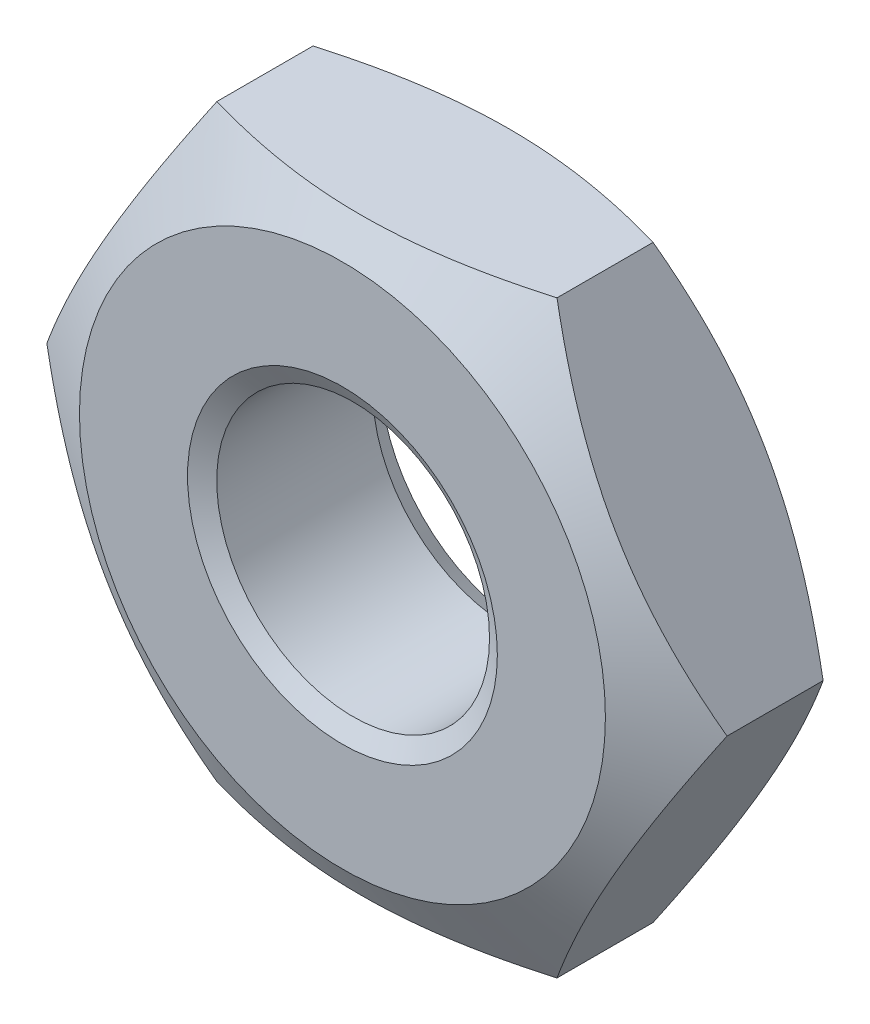
ISO-10303-21;
HEADER;
FILE_DESCRIPTION(('STEP AP214'),'2;1');
FILE_NAME('part.step','',(''),(''),'','','');
FILE_SCHEMA(('AUTOMOTIVE_DESIGN { 1 0 10303 214 1 1 1 1 }'));
ENDSEC;
DATA;
#1=APPLICATION_CONTEXT('core data for automotive mechanical design processes');
#2=APPLICATION_PROTOCOL_DEFINITION('international standard','automotive_design',2000,#1);
#3=PRODUCT_CONTEXT('',#1,'mechanical');
#4=PRODUCT('Part','Part','',(#3));
#5=PRODUCT_RELATED_PRODUCT_CATEGORY('part','',(#4));
#6=PRODUCT_DEFINITION_FORMATION('','',#4);
#7=PRODUCT_DEFINITION_CONTEXT('part definition',#1,'design');
#8=PRODUCT_DEFINITION('design','',#6,#7);
#9=PRODUCT_DEFINITION_SHAPE('','',#8);
#10=(LENGTH_UNIT() NAMED_UNIT(*) SI_UNIT(.MILLI.,.METRE.));
#11=(NAMED_UNIT(*) PLANE_ANGLE_UNIT() SI_UNIT($,.RADIAN.));
#12=(NAMED_UNIT(*) SI_UNIT($,.STERADIAN.) SOLID_ANGLE_UNIT());
#13=UNCERTAINTY_MEASURE_WITH_UNIT(LENGTH_MEASURE(1.E-05),#10,'distance_accuracy_value','');
#14=(GEOMETRIC_REPRESENTATION_CONTEXT(3) GLOBAL_UNCERTAINTY_ASSIGNED_CONTEXT((#13)) GLOBAL_UNIT_ASSIGNED_CONTEXT((#10,
#11,#12)) REPRESENTATION_CONTEXT('',''));
#15=CARTESIAN_POINT('',(0.,0.,0.));
#16=DIRECTION('',(0.,0.,1.));
#17=DIRECTION('',(1.,0.,0.));
#18=AXIS2_PLACEMENT_3D('',#15,#16,#17);
#19=CARTESIAN_POINT('',(-2.02072594216369,-3.5,-2.2));
#20=DIRECTION('',(0.,-1.,0.));
#21=DIRECTION('',(1.,0.,0.));
#22=AXIS2_PLACEMENT_3D('',#19,#20,#21);
#23=PLANE('',#22);
#24=CARTESIAN_POINT('',(-5.32929161655628,-3.5,-1.8768739570955));
#25=CARTESIAN_POINT('',(-5.17721390420334,-3.5,-1.80350487566599));
#26=CARTESIAN_POINT('',(-5.02477626879487,-3.5,-1.73086848507037));
#27=CARTESIAN_POINT('',(-4.71898932742077,-3.5,-1.58747532668502));
#28=CARTESIAN_POINT('',(-4.56563987276602,-3.5,-1.51671887634777));
#29=CARTESIAN_POINT('',(-4.25699896894404,-3.5,-1.37712246688914));
#30=CARTESIAN_POINT('',(-4.10170141818151,-3.5,-1.30829594938202));
#31=CARTESIAN_POINT('',(-3.78983593685733,-3.5,-1.17359495846471));
#32=CARTESIAN_POINT('',(-3.63326806987865,-3.5,-1.10772033836705));
#33=CARTESIAN_POINT('',(-3.31397317951131,-3.5,-0.977818284437842));
#34=CARTESIAN_POINT('',(-3.1512005381073,-3.5,-0.913902341262369));
#35=CARTESIAN_POINT('',(-2.82371486392436,-3.5,-0.791151177582951));
#36=CARTESIAN_POINT('',(-2.65900161073986,-3.5,-0.732316540636332));
#37=CARTESIAN_POINT('',(-2.32771428220931,-3.5,-0.62134515271391));
#38=CARTESIAN_POINT('',(-2.16114510129307,-3.5,-0.569193942659973));
#39=CARTESIAN_POINT('',(-1.82562056549125,-3.5,-0.473327366021486));
#40=CARTESIAN_POINT('',(-1.65666601191669,-3.5,-0.429609235647394));
#41=CARTESIAN_POINT('',(-1.31718369019254,-3.5,-0.352994778610296));
#42=CARTESIAN_POINT('',(-1.14666839877724,-3.5,-0.320044212866426));
#43=CARTESIAN_POINT('',(-0.803625193117589,-3.5,-0.266896804968947));
#44=CARTESIAN_POINT('',(-0.631097439623654,-3.5,-0.246698951170158));
#45=CARTESIAN_POINT('',(-0.287101025715154,-3.5,-0.220933629161962));
#46=CARTESIAN_POINT('',(-0.115646203356578,-3.5,-0.215185920399811));
#47=CARTESIAN_POINT('',(0.227139625224392,-3.5,-0.218339385870685));
#48=CARTESIAN_POINT('',(0.398470626774734,-3.5,-0.227241086660207));
#49=CARTESIAN_POINT('',(0.6923494546766,-3.5,-0.254460230237843));
#50=CARTESIAN_POINT('',(0.815219779631848,-3.5,-0.269472731532174));
#51=CARTESIAN_POINT('',(1.05998960024822,-3.5,-0.306041966481693));
#52=CARTESIAN_POINT('',(1.181888948341,-3.5,-0.327599676107725));
#53=CARTESIAN_POINT('',(1.54600794184171,-3.5,-0.400949728850132));
#54=CARTESIAN_POINT('',(1.78649842941779,-3.5,-0.461403324212362));
#55=CARTESIAN_POINT('',(2.14599672794727,-3.5,-0.565325828459473));
#56=CARTESIAN_POINT('',(2.26688905462246,-3.5,-0.602639268073536));
#57=CARTESIAN_POINT('',(2.50749825221244,-3.5,-0.680914127692014));
#58=CARTESIAN_POINT('',(2.62721511557209,-3.5,-0.72187557112648));
#59=CARTESIAN_POINT('',(2.86551603326948,-3.5,-0.806808159348505));
#60=CARTESIAN_POINT('',(2.98410049565285,-3.5,-0.850778169512184));
#61=CARTESIAN_POINT('',(3.22030222158571,-3.5,-0.941233650124732));
#62=CARTESIAN_POINT('',(3.33791949412912,-3.5,-0.987719097152017));
#63=CARTESIAN_POINT('',(3.60516917077565,-3.5,-1.09611499692003));
#64=CARTESIAN_POINT('',(3.75452937338733,-3.5,-1.15869521360889));
#65=CARTESIAN_POINT('',(4.05207329900666,-3.5,-1.28659848231524));
#66=CARTESIAN_POINT('',(4.20025696631961,-3.5,-1.3519216632692));
#67=CARTESIAN_POINT('',(4.64337511468222,-3.5,-1.55119395906001));
#68=CARTESIAN_POINT('',(4.93683132148516,-3.5,-1.68842699826924));
#69=CARTESIAN_POINT('',(5.52118834964412,-3.5,-1.96881056529861));
#70=CARTESIAN_POINT('',(5.81208673093574,-3.5,-2.11196612775869));
#71=CARTESIAN_POINT('',(6.39186182500917,-3.5,-2.40232740635005));
#72=CARTESIAN_POINT('',(6.6807384726872,-3.5,-2.54953325216252));
#73=CARTESIAN_POINT('',(7.23458971233424,-3.5,-2.83528891127492));
#74=CARTESIAN_POINT('',(7.49967651841012,-3.5,-2.97362193480413));
#75=CARTESIAN_POINT('',(8.02887233479629,-3.5,-3.25216194114886));
#76=CARTESIAN_POINT('',(8.29298131706612,-3.5,-3.39236897718082));
#77=CARTESIAN_POINT('',(8.81986478761872,-3.5,-3.67392059383067));
#78=CARTESIAN_POINT('',(9.082640922202,-3.5,-3.81526209803769));
#79=CARTESIAN_POINT('',(9.60756200305391,-3.5,-4.09908318288939));
#80=CARTESIAN_POINT('',(9.86970697870069,-3.5,-4.2415627091763));
#81=CARTESIAN_POINT('',(10.1316166656573,-3.5,-4.38447053028153));
#82=B_SPLINE_CURVE_WITH_KNOTS('',3,(#24,#25,#26,#27,#28,#29,#30,#31,#32,#33,#34,#35,#36,#37,#38,
#39,#40,#41,#42,#43,#44,#45,#46,#47,#48,#49,#50,#51,#52,#53,#54,#55,#56,#57,#58,#59,#60,#61,#62,
#63,#64,#65,#66,#67,#68,#69,#70,#71,#72,#73,#74,#75,#76,#77,#78,#79,#80,#81),.UNSPECIFIED.,.F.,
.F.,(4,2,2,2,2,2,2,2,2,2,2,2,2,2,2,2,2,2,2,2,2,2,2,2,2,2,2,2,4),(0.,0.506559628514695,
1.0132042594806,1.52277737705624,2.03232514447318,2.55687533860672,3.08148569427768,
3.60494121555669,4.12822489118331,4.64883048979078,5.16939478468659,5.68343298490769,
6.19748966205548,6.56865983363451,6.93988537844331,7.6827872097227,8.06231738596215,
8.44184999998748,8.82124026111235,9.20062699028891,9.68641258911835,10.1722210485271,
11.1439854050423,12.1165935361164,13.0892328442916,13.986254382644,14.8833014481238,
15.7784288466623,16.6735137420071),.UNSPECIFIED.);
#83=CARTESIAN_POINT('',(-2.02072594216369,-3.5,-0.529113742115746));
#84=VERTEX_POINT('',#83);
#85=CARTESIAN_POINT('',(2.02072594216369,-3.5,-0.529113742115746));
#86=VERTEX_POINT('',#85);
#87=EDGE_CURVE('E61',#84,#86,#82,.T.);
#88=ORIENTED_EDGE('',*,*,#87,.F.);
#89=DIRECTION('',(0.,0.,1.));
#90=VECTOR('',#89,1.);
#91=CARTESIAN_POINT('',(-2.02072594216369,-3.5,-2.2));
#92=LINE('',#91,#90);
#93=CARTESIAN_POINT('',(-2.02072594216369,-3.5,-1.67088625788425));
#94=VERTEX_POINT('',#93);
#95=EDGE_CURVE('E117',#94,#84,#92,.T.);
#96=ORIENTED_EDGE('',*,*,#95,.F.);
#97=CARTESIAN_POINT('',(-5.32929161655628,-3.5,-0.323126042904503));
#98=CARTESIAN_POINT('',(-5.17721390420334,-3.5,-0.396495124334005));
#99=CARTESIAN_POINT('',(-5.02477626879487,-3.5,-0.46913151492963));
#100=CARTESIAN_POINT('',(-4.71898932742077,-3.5,-0.612524673314982));
#101=CARTESIAN_POINT('',(-4.56563987276602,-3.5,-0.683281123652231));
#102=CARTESIAN_POINT('',(-4.25699896894404,-3.5,-0.822877533110863));
#103=CARTESIAN_POINT('',(-4.10170141818151,-3.5,-0.891704050617982));
#104=CARTESIAN_POINT('',(-3.78983593685733,-3.5,-1.02640504153529));
#105=CARTESIAN_POINT('',(-3.63326806987865,-3.5,-1.09227966163295));
#106=CARTESIAN_POINT('',(-3.31397317951131,-3.5,-1.22218171556216));
#107=CARTESIAN_POINT('',(-3.1512005381073,-3.5,-1.28609765873763));
#108=CARTESIAN_POINT('',(-2.82371486392436,-3.5,-1.40884882241705));
#109=CARTESIAN_POINT('',(-2.65900161073986,-3.5,-1.46768345936367));
#110=CARTESIAN_POINT('',(-2.32771428220931,-3.5,-1.57865484728609));
#111=CARTESIAN_POINT('',(-2.16114510129307,-3.5,-1.63080605734003));
#112=CARTESIAN_POINT('',(-1.82562056549125,-3.5,-1.72667263397851));
#113=CARTESIAN_POINT('',(-1.65666601191669,-3.5,-1.77039076435261));
#114=CARTESIAN_POINT('',(-1.31718369019254,-3.5,-1.8470052213897));
#115=CARTESIAN_POINT('',(-1.14666839877724,-3.5,-1.87995578713357));
#116=CARTESIAN_POINT('',(-0.803625193117588,-3.5,-1.93310319503105));
#117=CARTESIAN_POINT('',(-0.631097439623654,-3.5,-1.95330104882984));
#118=CARTESIAN_POINT('',(-0.287101025715154,-3.5,-1.97906637083804));
#119=CARTESIAN_POINT('',(-0.115646203356578,-3.5,-1.98481407960019));
#120=CARTESIAN_POINT('',(0.227139625224392,-3.5,-1.98166061412932));
#121=CARTESIAN_POINT('',(0.398470626774735,-3.5,-1.97275891333979));
#122=CARTESIAN_POINT('',(0.6923494546766,-3.5,-1.94553976976216));
#123=CARTESIAN_POINT('',(0.815219779631849,-3.5,-1.93052726846783));
#124=CARTESIAN_POINT('',(1.05998960024822,-3.5,-1.89395803351831));
#125=CARTESIAN_POINT('',(1.181888948341,-3.5,-1.87240032389228));
#126=CARTESIAN_POINT('',(1.54600794184172,-3.5,-1.79905027114987));
#127=CARTESIAN_POINT('',(1.78649842941779,-3.5,-1.73859667578764));
#128=CARTESIAN_POINT('',(2.14599672794727,-3.5,-1.63467417154053));
#129=CARTESIAN_POINT('',(2.26688905462246,-3.5,-1.59736073192646));
#130=CARTESIAN_POINT('',(2.50749825221244,-3.5,-1.51908587230799));
#131=CARTESIAN_POINT('',(2.62721511557209,-3.5,-1.47812442887352));
#132=CARTESIAN_POINT('',(2.86551603326948,-3.5,-1.39319184065149));
#133=CARTESIAN_POINT('',(2.98410049565285,-3.5,-1.34922183048782));
#134=CARTESIAN_POINT('',(3.22030222158572,-3.5,-1.25876634987527));
#135=CARTESIAN_POINT('',(3.33791949412912,-3.5,-1.21228090284798));
#136=CARTESIAN_POINT('',(3.60516917077565,-3.5,-1.10388500307997));
#137=CARTESIAN_POINT('',(3.75452937338733,-3.5,-1.04130478639111));
#138=CARTESIAN_POINT('',(4.05207329900666,-3.5,-0.913401517684762));
#139=CARTESIAN_POINT('',(4.20025696631961,-3.5,-0.848078336730801));
#140=CARTESIAN_POINT('',(4.64337511468222,-3.5,-0.648806040939991));
#141=CARTESIAN_POINT('',(4.93683132148517,-3.5,-0.511573001730763));
#142=CARTESIAN_POINT('',(5.52118834964412,-3.5,-0.231189434701387));
#143=CARTESIAN_POINT('',(5.81208673093574,-3.5,-0.0880338722413048));
#144=CARTESIAN_POINT('',(6.39186182500918,-3.5,0.202327406350052));
#145=CARTESIAN_POINT('',(6.6807384726872,-3.5,0.34953325216252));
#146=CARTESIAN_POINT('',(7.23458971233424,-3.5,0.635288911274919));
#147=CARTESIAN_POINT('',(7.49967651841012,-3.5,0.773621934804134));
#148=CARTESIAN_POINT('',(8.02887233479629,-3.5,1.05216194114886));
#149=CARTESIAN_POINT('',(8.29298131706612,-3.5,1.19236897718082));
#150=CARTESIAN_POINT('',(8.81986478761872,-3.5,1.47392059383067));
#151=CARTESIAN_POINT('',(9.082640922202,-3.5,1.61526209803769));
#152=CARTESIAN_POINT('',(9.60756200305391,-3.5,1.89908318288939));
#153=CARTESIAN_POINT('',(9.86970697870069,-3.5,2.0415627091763));
#154=CARTESIAN_POINT('',(10.1316166656573,-3.5,2.18447053028153));
#155=B_SPLINE_CURVE_WITH_KNOTS('',3,(#97,#98,#99,#100,#101,#102,#103,#104,#105,#106,#107,#108,
#109,#110,#111,#112,#113,#114,#115,#116,#117,#118,#119,#120,#121,#122,#123,#124,#125,#126,#127,
#128,#129,#130,#131,#132,#133,#134,#135,#136,#137,#138,#139,#140,#141,#142,#143,#144,#145,#146,
#147,#148,#149,#150,#151,#152,#153,#154),.UNSPECIFIED.,.F.,.F.,(4,2,2,2,2,2,2,2,2,2,2,2,2,2,2,2,
2,2,2,2,2,2,2,2,2,2,2,2,4),(0.,0.506559628514696,1.0132042594806,1.52277737705624,
2.03232514447318,2.55687533860672,3.08148569427768,3.60494121555669,4.12822489118331,
4.64883048979078,5.16939478468659,5.68343298490769,6.19748966205548,6.56865983363451,
6.93988537844331,7.6827872097227,8.06231738596215,8.44184999998748,8.82124026111235,
9.20062699028891,9.68641258911835,10.1722210485271,11.1439854050423,12.1165935361164,
13.0892328442916,13.986254382644,14.8833014481238,15.7784288466623,16.6735137420071),.UNSPECIFIED.);
#156=CARTESIAN_POINT('',(2.02072594216369,-3.5,-1.67088625788425));
#157=VERTEX_POINT('',#156);
#158=EDGE_CURVE('E145',#157,#94,#155,.F.);
#159=ORIENTED_EDGE('',*,*,#158,.F.);
#160=DIRECTION('',(0.,0.,1.));
#161=VECTOR('',#160,1.);
#162=CARTESIAN_POINT('',(2.02072594216369,-3.5,-2.2));
#163=LINE('',#162,#161);
#164=EDGE_CURVE('E141',#157,#86,#163,.T.);
#165=ORIENTED_EDGE('',*,*,#164,.T.);
#166=EDGE_LOOP('',(#88,#96,#159,#165));
#167=FACE_BOUND('',#166,.T.);
#168=ADVANCED_FACE('F45',(#167),#23,.T.);
#169=CARTESIAN_POINT('',(-4.04145188432738,0.,-2.2));
#170=DIRECTION('',(-0.866025403784438,-0.5,0.));
#171=DIRECTION('',(0.5,-0.866025403784439,0.));
#172=AXIS2_PLACEMENT_3D('',#169,#170,#171);
#173=PLANE('',#172);
#174=CARTESIAN_POINT('',(-4.04156735438122,0.000200000000000874,-0.529180411639474));
#175=CARTESIAN_POINT('',(-3.9527667384984,-0.153607178452449,-0.477892139936087));
#176=CARTESIAN_POINT('',(-3.86319960126198,-0.308742010834423,-0.431247304762301));
#177=CARTESIAN_POINT('',(-3.68251437287562,-0.62169800657678,-0.349828226479454));
#178=CARTESIAN_POINT('',(-3.59139307116725,-0.779524730787494,-0.315082786530667));
#179=CARTESIAN_POINT('',(-3.41027974688034,-1.09322221038013,-0.260996378128942));
#180=CARTESIAN_POINT('',(-3.32031559103708,-1.24904469916069,-0.241295437206488));
#181=CARTESIAN_POINT('',(-3.13996396008052,-1.56142288720537,-0.217776483683361));
#182=CARTESIAN_POINT('',(-3.04957714051106,-1.71797745103423,-0.213938995491671));
#183=CARTESIAN_POINT('',(-2.88068384499777,-2.01050921992099,-0.221921652823084));
#184=CARTESIAN_POINT('',(-2.80215208834114,-2.1465302124579,-0.231781785015713));
#185=CARTESIAN_POINT('',(-2.64560020969753,-2.41768602028899,-0.263032817845509));
#186=CARTESIAN_POINT('',(-2.5675806292065,-2.55281989768468,-0.284434394231903));
#187=CARTESIAN_POINT('',(-2.41070596159678,-2.82453479240518,-0.337936758826681));
#188=CARTESIAN_POINT('',(-2.33187072981463,-2.96108141927833,-0.370264345391191));
#189=CARTESIAN_POINT('',(-2.17537608630783,-3.2321380929445,-0.443635284754097));
#190=CARTESIAN_POINT('',(-2.09771466960098,-3.36665161246854,-0.48466139751597));
#191=CARTESIAN_POINT('',(-2.02061047210985,-3.5002,-0.529180411639473));
#192=B_SPLINE_CURVE_WITH_KNOTS('',3,(#174,#175,#176,#177,#178,#179,#180,#181,#182,#183,#184,
#185,#186,#187,#188,#189,#190,#191),.UNSPECIFIED.,.F.,.F.,(4,2,2,2,2,2,2,2,4),(0.,
0.554793832886253,1.11092123814983,1.65328467083218,2.19498204478403,2.6666513085086,
3.13875761298267,3.6213361260051,4.10296698719187),.UNSPECIFIED.);
#193=CARTESIAN_POINT('',(-4.04145188432738,0.,-0.529113742115746));
#194=VERTEX_POINT('',#193);
#195=EDGE_CURVE('E101',#194,#84,#192,.T.);
#196=ORIENTED_EDGE('',*,*,#195,.F.);
#197=DIRECTION('',(0.,0.,1.));
#198=VECTOR('',#197,1.);
#199=CARTESIAN_POINT('',(-4.04145188432738,0.,-2.2));
#200=LINE('',#199,#198);
#201=CARTESIAN_POINT('',(-4.04145188432738,0.,-1.67088625788425));
#202=VERTEX_POINT('',#201);
#203=EDGE_CURVE('E115',#202,#194,#200,.T.);
#204=ORIENTED_EDGE('',*,*,#203,.F.);
#205=CARTESIAN_POINT('',(-2.02061047210985,-3.5002,-1.67081958836053));
#206=CARTESIAN_POINT('',(-2.10941108799267,-3.34639282154755,-1.72210786006391));
#207=CARTESIAN_POINT('',(-2.19897822522909,-3.19125798916558,-1.7687526952377));
#208=CARTESIAN_POINT('',(-2.37966345361545,-2.87830199342322,-1.85017177352055));
#209=CARTESIAN_POINT('',(-2.47078475532382,-2.72047526921251,-1.88491721346933));
#210=CARTESIAN_POINT('',(-2.65189807961073,-2.40677778961987,-1.93900362187106));
#211=CARTESIAN_POINT('',(-2.74186223545399,-2.25095530083931,-1.95870456279351));
#212=CARTESIAN_POINT('',(-2.92221386641055,-1.93857711279463,-1.98222351631664));
#213=CARTESIAN_POINT('',(-3.01260068598001,-1.78202254896577,-1.98606100450833));
#214=CARTESIAN_POINT('',(-3.1814939814933,-1.48949078007901,-1.97807834717692));
#215=CARTESIAN_POINT('',(-3.26002573814993,-1.3534697875421,-1.96821821498429));
#216=CARTESIAN_POINT('',(-3.41657761679354,-1.08231397971101,-1.93696718215449));
#217=CARTESIAN_POINT('',(-3.49459719728457,-0.947180102315318,-1.9155656057681));
#218=CARTESIAN_POINT('',(-3.65147186489429,-0.675465207594817,-1.86206324117332));
#219=CARTESIAN_POINT('',(-3.73030709667644,-0.538918580721665,-1.82973565460881));
#220=CARTESIAN_POINT('',(-3.88680174018324,-0.267861907055498,-1.7563647152459));
#221=CARTESIAN_POINT('',(-3.96446315689009,-0.133348387531463,-1.71533860248403));
#222=CARTESIAN_POINT('',(-4.04156735438122,0.000200000000001224,-1.67081958836053));
#223=B_SPLINE_CURVE_WITH_KNOTS('',3,(#205,#206,#207,#208,#209,#210,#211,#212,#213,#214,#215,
#216,#217,#218,#219,#220,#221,#222),.UNSPECIFIED.,.F.,.F.,(4,2,2,2,2,2,2,2,4),(0.,
0.554793832886253,1.11092123814983,1.65328467083218,2.19498204478403,2.6666513085086,
3.13875761298267,3.6213361260051,4.10296698719187),.UNSPECIFIED.);
#224=EDGE_CURVE('E224',#94,#202,#223,.T.);
#225=ORIENTED_EDGE('',*,*,#224,.F.);
#226=ORIENTED_EDGE('',*,*,#95,.T.);
#227=EDGE_LOOP('',(#196,#204,#225,#226));
#228=FACE_BOUND('',#227,.T.);
#229=ADVANCED_FACE('F113',(#228),#173,.T.);
#230=CARTESIAN_POINT('',(-2.02072594216369,3.5,-2.2));
#231=DIRECTION('',(-0.866025403784439,0.5,0.));
#232=DIRECTION('',(-0.5,-0.866025403784438,0.));
#233=AXIS2_PLACEMENT_3D('',#230,#231,#232);
#234=PLANE('',#233);
#235=CARTESIAN_POINT('',(-2.02061047210985,3.5002,-0.529180411639474));
#236=CARTESIAN_POINT('',(-2.10941108799267,3.34639282154755,-0.477892139936087));
#237=CARTESIAN_POINT('',(-2.19897822522909,3.19125798916558,-0.431247304762301));
#238=CARTESIAN_POINT('',(-2.37966345361545,2.87830199342322,-0.349828226479454));
#239=CARTESIAN_POINT('',(-2.47078475532382,2.72047526921251,-0.315082786530667));
#240=CARTESIAN_POINT('',(-2.65189807961073,2.40677778961987,-0.260996378128942));
#241=CARTESIAN_POINT('',(-2.74186223545399,2.25095530083931,-0.241295437206488));
#242=CARTESIAN_POINT('',(-2.92221386641056,1.93857711279463,-0.217776483683361));
#243=CARTESIAN_POINT('',(-3.01260068598001,1.78202254896577,-0.213938995491672));
#244=CARTESIAN_POINT('',(-3.1814939814933,1.48949078007901,-0.221921652823084));
#245=CARTESIAN_POINT('',(-3.26002573814993,1.3534697875421,-0.231781785015713));
#246=CARTESIAN_POINT('',(-3.41657761679354,1.08231397971101,-0.263032817845509));
#247=CARTESIAN_POINT('',(-3.49459719728458,0.947180102315319,-0.284434394231904));
#248=CARTESIAN_POINT('',(-3.65147186489429,0.675465207594818,-0.337936758826682));
#249=CARTESIAN_POINT('',(-3.73030709667644,0.538918580721666,-0.370264345391192));
#250=CARTESIAN_POINT('',(-3.88680174018324,0.267861907055499,-0.443635284754098));
#251=CARTESIAN_POINT('',(-3.96446315689009,0.133348387531464,-0.48466139751597));
#252=CARTESIAN_POINT('',(-4.04156735438122,-0.000199999999999131,-0.529180411639474));
#253=B_SPLINE_CURVE_WITH_KNOTS('',3,(#235,#236,#237,#238,#239,#240,#241,#242,#243,#244,#245,
#246,#247,#248,#249,#250,#251,#252),.UNSPECIFIED.,.F.,.F.,(4,2,2,2,2,2,2,2,4),(0.,
0.554793832886253,1.11092123814983,1.65328467083218,2.19498204478403,2.6666513085086,
3.13875761298267,3.62133612600509,4.10296698719187),.UNSPECIFIED.);
#254=CARTESIAN_POINT('',(-2.02072594216369,3.5,-0.529113742115746));
#255=VERTEX_POINT('',#254);
#256=EDGE_CURVE('E97',#255,#194,#253,.T.);
#257=ORIENTED_EDGE('',*,*,#256,.F.);
#258=DIRECTION('',(0.,0.,1.));
#259=VECTOR('',#258,1.);
#260=CARTESIAN_POINT('',(-2.02072594216369,3.5,-2.2));
#261=LINE('',#260,#259);
#262=CARTESIAN_POINT('',(-2.02072594216369,3.5,-1.67088625788425));
#263=VERTEX_POINT('',#262);
#264=EDGE_CURVE('E124',#263,#255,#261,.T.);
#265=ORIENTED_EDGE('',*,*,#264,.F.);
#266=CARTESIAN_POINT('',(-4.04156735438122,-0.000199999999999165,-1.67081958836053));
#267=CARTESIAN_POINT('',(-3.9527667384984,0.15360717845245,-1.72210786006391));
#268=CARTESIAN_POINT('',(-3.86319960126198,0.308742010834424,-1.7687526952377));
#269=CARTESIAN_POINT('',(-3.68251437287562,0.621698006576781,-1.85017177352055));
#270=CARTESIAN_POINT('',(-3.59139307116725,0.779524730787496,-1.88491721346933));
#271=CARTESIAN_POINT('',(-3.41027974688034,1.09322221038013,-1.93900362187106));
#272=CARTESIAN_POINT('',(-3.32031559103708,1.24904469916069,-1.95870456279351));
#273=CARTESIAN_POINT('',(-3.13996396008052,1.56142288720537,-1.98222351631664));
#274=CARTESIAN_POINT('',(-3.04957714051106,1.71797745103423,-1.98606100450833));
#275=CARTESIAN_POINT('',(-2.88068384499777,2.01050921992099,-1.97807834717692));
#276=CARTESIAN_POINT('',(-2.80215208834114,2.14653021245791,-1.96821821498429));
#277=CARTESIAN_POINT('',(-2.64560020969753,2.41768602028899,-1.93696718215449));
#278=CARTESIAN_POINT('',(-2.5675806292065,2.55281989768468,-1.9155656057681));
#279=CARTESIAN_POINT('',(-2.41070596159678,2.82453479240518,-1.86206324117332));
#280=CARTESIAN_POINT('',(-2.33187072981463,2.96108141927834,-1.82973565460881));
#281=CARTESIAN_POINT('',(-2.17537608630783,3.2321380929445,-1.7563647152459));
#282=CARTESIAN_POINT('',(-2.09771466960098,3.36665161246854,-1.71533860248403));
#283=CARTESIAN_POINT('',(-2.02061047210985,3.5002,-1.67081958836053));
#284=B_SPLINE_CURVE_WITH_KNOTS('',3,(#266,#267,#268,#269,#270,#271,#272,#273,#274,#275,#276,
#277,#278,#279,#280,#281,#282,#283),.UNSPECIFIED.,.F.,.F.,(4,2,2,2,2,2,2,2,4),(0.,
0.554793832886252,1.11092123814983,1.65328467083218,2.19498204478403,2.6666513085086,
3.13875761298267,3.62133612600509,4.10296698719187),.UNSPECIFIED.);
#285=EDGE_CURVE('E122',#202,#263,#284,.T.);
#286=ORIENTED_EDGE('',*,*,#285,.F.);
#287=ORIENTED_EDGE('',*,*,#203,.T.);
#288=EDGE_LOOP('',(#257,#265,#286,#287));
#289=FACE_BOUND('',#288,.T.);
#290=ADVANCED_FACE('F121',(#289),#234,.T.);
#291=CARTESIAN_POINT('',(2.02072594216369,3.5,-2.2));
#292=DIRECTION('',(0.,1.,0.));
#293=DIRECTION('',(0.,0.,1.));
#294=AXIS2_PLACEMENT_3D('',#291,#292,#293);
#295=PLANE('',#294);
#296=CARTESIAN_POINT('',(-5.32929161654317,3.5,-1.87687395708917));
#297=CARTESIAN_POINT('',(-5.17721390419067,3.5,-1.80350487565994));
#298=CARTESIAN_POINT('',(-5.02477626878264,3.5,-1.73086848506458));
#299=CARTESIAN_POINT('',(-4.71898932740942,3.5,-1.58747532667976));
#300=CARTESIAN_POINT('',(-4.56563987275511,3.5,-1.51671887634277));
#301=CARTESIAN_POINT('',(-4.25699896893402,3.5,-1.37712246688467));
#302=CARTESIAN_POINT('',(-4.10170141817195,3.5,-1.30829594937782));
#303=CARTESIAN_POINT('',(-3.78983593684867,3.5,-1.17359495846103));
#304=CARTESIAN_POINT('',(-3.63326806987044,3.5,-1.10772033836364));
#305=CARTESIAN_POINT('',(-3.31397317950403,3.5,-0.977818284434954));
#306=CARTESIAN_POINT('',(-3.1512005381005,3.5,-0.913902341259745));
#307=CARTESIAN_POINT('',(-2.82371486391854,3.5,-0.791151177580841));
#308=CARTESIAN_POINT('',(-2.65900161073452,3.5,-0.732316540634472));
#309=CARTESIAN_POINT('',(-2.32771428220496,3.5,-0.621345152712525));
#310=CARTESIAN_POINT('',(-2.16114510128922,3.5,-0.569193942658812));
#311=CARTESIAN_POINT('',(-1.82562056548841,3.5,-0.473327366020735));
#312=CARTESIAN_POINT('',(-1.65666601191436,3.5,-0.42960923564683));
#313=CARTESIAN_POINT('',(-1.31718369019152,3.5,-0.352994778610105));
#314=CARTESIAN_POINT('',(-1.14666839877701,3.5,-0.320044212866405));
#315=CARTESIAN_POINT('',(-0.803625193118965,3.5,-0.266896804969146));
#316=CARTESIAN_POINT('',(-0.631097439625841,3.5,-0.246698951170405));
#317=CARTESIAN_POINT('',(-0.287101025718949,3.5,-0.220933629162164));
#318=CARTESIAN_POINT('',(-0.115646203361171,3.5,-0.215185920399921));
#319=CARTESIAN_POINT('',(0.227139625218219,3.5,-0.218339385870476));
#320=CARTESIAN_POINT('',(0.39847062676778,3.5,-0.227241086659772));
#321=CARTESIAN_POINT('',(0.692349454668639,3.5,-0.254460230236955));
#322=CARTESIAN_POINT('',(0.815219779623655,3.5,-0.269472731531103));
#323=CARTESIAN_POINT('',(1.05998960023958,3.5,-0.306041966480247));
#324=CARTESIAN_POINT('',(1.18188894833212,3.5,-0.327599676106087));
#325=CARTESIAN_POINT('',(1.54600794183219,3.5,-0.400949728847913));
#326=CARTESIAN_POINT('',(1.78649842940784,3.5,-0.461403324209749));
#327=CARTESIAN_POINT('',(2.14599672793669,3.5,-0.565325828456279));
#328=CARTESIAN_POINT('',(2.26688905461166,3.5,-0.602639268070147));
#329=CARTESIAN_POINT('',(2.50749825220121,3.5,-0.68091412768824));
#330=CARTESIAN_POINT('',(2.62721511556065,3.5,-0.721875571122515));
#331=CARTESIAN_POINT('',(2.86551603325762,3.5,-0.806808159344166));
#332=CARTESIAN_POINT('',(2.98410049564078,3.5,-0.850778169507661));
#333=CARTESIAN_POINT('',(3.22030222157322,3.5,-0.941233650119847));
#334=CARTESIAN_POINT('',(3.33791949411641,3.5,-0.987719097146953));
#335=CARTESIAN_POINT('',(3.60516917076279,3.5,-1.0961149969147));
#336=CARTESIAN_POINT('',(3.75452937337452,3.5,-1.15869521360348));
#337=CARTESIAN_POINT('',(4.05207329899395,3.5,-1.28659848230968));
#338=CARTESIAN_POINT('',(4.20025696630695,3.5,-1.35192166326358));
#339=CARTESIAN_POINT('',(4.64337511466969,3.5,-1.55119395905422));
#340=CARTESIAN_POINT('',(4.93683132147272,3.5,-1.68842699826337));
#341=CARTESIAN_POINT('',(5.52118834963183,3.5,-1.96881056529261));
#342=CARTESIAN_POINT('',(5.81208673092351,3.5,-2.11196612775264));
#343=CARTESIAN_POINT('',(6.39186182499708,3.5,-2.40232740634392));
#344=CARTESIAN_POINT('',(6.68073847267516,3.5,-2.54953325215636));
#345=CARTESIAN_POINT('',(7.23458971232227,3.5,-2.83528891126869));
#346=CARTESIAN_POINT('',(7.49967651839816,3.5,-2.97362193479787));
#347=CARTESIAN_POINT('',(8.02887233478434,3.5,-3.25216194114253));
#348=CARTESIAN_POINT('',(8.29298131705417,3.5,-3.39236897717446));
#349=CARTESIAN_POINT('',(8.81986478760678,3.5,-3.67392059382426));
#350=CARTESIAN_POINT('',(9.08264092219005,3.5,-3.81526209803125));
#351=CARTESIAN_POINT('',(9.60756200304195,3.5,-4.0990831828829));
#352=CARTESIAN_POINT('',(9.86970697868872,3.5,-4.24156270916979));
#353=CARTESIAN_POINT('',(10.1316166656453,3.5,-4.384470530275));
#354=B_SPLINE_CURVE_WITH_KNOTS('',3,(#296,#297,#298,#299,#300,#301,#302,#303,#304,#305,#306,
#307,#308,#309,#310,#311,#312,#313,#314,#315,#316,#317,#318,#319,#320,#321,#322,#323,#324,#325,
#326,#327,#328,#329,#330,#331,#332,#333,#334,#335,#336,#337,#338,#339,#340,#341,#342,#343,#344,
#345,#346,#347,#348,#349,#350,#351,#352,#353),.UNSPECIFIED.,.F.,.F.,(4,2,2,2,2,2,2,2,2,2,2,2,2,
2,2,2,2,2,2,2,2,2,2,2,2,2,2,2,4),(0.,0.50655962851316,1.01320425947753,1.52277737705162,
2.03232514446701,2.55687533859891,3.08148569426823,3.60494121554562,4.12822489117061,
4.64883048977565,5.16939478466903,5.68343298488776,6.19748966203318,6.56865983361145,
6.93988537841949,7.68278720969736,8.06231738593603,8.44184999996057,8.82124026108465,
9.20062699026042,9.68641258908992,10.1722210484987,11.143985405014,12.1165935360882,
13.0892328442636,13.9862543826159,14.8833014480957,15.7784288466341,16.6735137419789),.UNSPECIFIED.);
#355=CARTESIAN_POINT('',(2.02072594216369,3.5,-0.529113742115746));
#356=VERTEX_POINT('',#355);
#357=EDGE_CURVE('E103',#356,#255,#354,.F.);
#358=ORIENTED_EDGE('',*,*,#357,.F.);
#359=DIRECTION('',(0.,0.,1.));
#360=VECTOR('',#359,1.);
#361=CARTESIAN_POINT('',(2.02072594216369,3.5,-2.2));
#362=LINE('',#361,#360);
#363=CARTESIAN_POINT('',(2.02072594216369,3.5,-1.67088625788425));
#364=VERTEX_POINT('',#363);
#365=EDGE_CURVE('E130',#364,#356,#362,.T.);
#366=ORIENTED_EDGE('',*,*,#365,.F.);
#367=CARTESIAN_POINT('',(-5.32929161654317,3.5,-0.323126042910828));
#368=CARTESIAN_POINT('',(-5.17721390419067,3.5,-0.396495124340064));
#369=CARTESIAN_POINT('',(-5.02477626878264,3.5,-0.469131514935422));
#370=CARTESIAN_POINT('',(-4.71898932740942,3.5,-0.612524673320243));
#371=CARTESIAN_POINT('',(-4.56563987275511,3.5,-0.683281123657226));
#372=CARTESIAN_POINT('',(-4.25699896893402,3.5,-0.822877533115329));
#373=CARTESIAN_POINT('',(-4.10170141817195,3.5,-0.891704050622182));
#374=CARTESIAN_POINT('',(-3.78983593684867,3.5,-1.02640504153897));
#375=CARTESIAN_POINT('',(-3.63326806987044,3.5,-1.09227966163636));
#376=CARTESIAN_POINT('',(-3.31397317950403,3.5,-1.22218171556505));
#377=CARTESIAN_POINT('',(-3.1512005381005,3.5,-1.28609765874026));
#378=CARTESIAN_POINT('',(-2.82371486391854,3.5,-1.40884882241916));
#379=CARTESIAN_POINT('',(-2.65900161073452,3.5,-1.46768345936553));
#380=CARTESIAN_POINT('',(-2.32771428220496,3.5,-1.57865484728748));
#381=CARTESIAN_POINT('',(-2.16114510128922,3.5,-1.63080605734119));
#382=CARTESIAN_POINT('',(-1.82562056548841,3.5,-1.72667263397926));
#383=CARTESIAN_POINT('',(-1.65666601191436,3.5,-1.77039076435317));
#384=CARTESIAN_POINT('',(-1.31718369019152,3.5,-1.8470052213899));
#385=CARTESIAN_POINT('',(-1.14666839877701,3.5,-1.87995578713359));
#386=CARTESIAN_POINT('',(-0.803625193118965,3.5,-1.93310319503085));
#387=CARTESIAN_POINT('',(-0.631097439625842,3.5,-1.95330104882959));
#388=CARTESIAN_POINT('',(-0.287101025718949,3.5,-1.97906637083784));
#389=CARTESIAN_POINT('',(-0.115646203361171,3.5,-1.98481407960008));
#390=CARTESIAN_POINT('',(0.227139625218219,3.5,-1.98166061412952));
#391=CARTESIAN_POINT('',(0.398470626767779,3.5,-1.97275891334023));
#392=CARTESIAN_POINT('',(0.692349454668638,3.5,-1.94553976976305));
#393=CARTESIAN_POINT('',(0.815219779623654,3.5,-1.9305272684689));
#394=CARTESIAN_POINT('',(1.05998960023957,3.5,-1.89395803351975));
#395=CARTESIAN_POINT('',(1.18188894833212,3.5,-1.87240032389391));
#396=CARTESIAN_POINT('',(1.54600794183219,3.5,-1.79905027115209));
#397=CARTESIAN_POINT('',(1.78649842940784,3.5,-1.73859667579025));
#398=CARTESIAN_POINT('',(2.14599672793669,3.5,-1.63467417154372));
#399=CARTESIAN_POINT('',(2.26688905461166,3.5,-1.59736073192985));
#400=CARTESIAN_POINT('',(2.50749825220121,3.5,-1.51908587231176));
#401=CARTESIAN_POINT('',(2.62721511556065,3.5,-1.47812442887749));
#402=CARTESIAN_POINT('',(2.86551603325762,3.5,-1.39319184065583));
#403=CARTESIAN_POINT('',(2.98410049564077,3.5,-1.34922183049234));
#404=CARTESIAN_POINT('',(3.22030222157322,3.5,-1.25876634988015));
#405=CARTESIAN_POINT('',(3.33791949411641,3.5,-1.21228090285305));
#406=CARTESIAN_POINT('',(3.60516917076279,3.5,-1.1038850030853));
#407=CARTESIAN_POINT('',(3.75452937337452,3.5,-1.04130478639652));
#408=CARTESIAN_POINT('',(4.05207329899395,3.5,-0.913401517690318));
#409=CARTESIAN_POINT('',(4.20025696630695,3.5,-0.84807833673642));
#410=CARTESIAN_POINT('',(4.64337511466969,3.5,-0.648806040945776));
#411=CARTESIAN_POINT('',(4.93683132147272,3.5,-0.511573001736632));
#412=CARTESIAN_POINT('',(5.52118834963183,3.5,-0.23118943470739));
#413=CARTESIAN_POINT('',(5.81208673092351,3.5,-0.088033872247357));
#414=CARTESIAN_POINT('',(6.39186182499708,3.5,0.202327406343922));
#415=CARTESIAN_POINT('',(6.68073847267516,3.5,0.349533252156361));
#416=CARTESIAN_POINT('',(7.23458971232227,3.5,0.635288911268695));
#417=CARTESIAN_POINT('',(7.49967651839816,3.5,0.773621934797874));
#418=CARTESIAN_POINT('',(8.02887233478434,3.5,1.05216194114253));
#419=CARTESIAN_POINT('',(8.29298131705417,3.5,1.19236897717446));
#420=CARTESIAN_POINT('',(8.81986478760678,3.5,1.47392059382426));
#421=CARTESIAN_POINT('',(9.08264092219005,3.5,1.61526209803125));
#422=CARTESIAN_POINT('',(9.60756200304195,3.5,1.8990831828829));
#423=CARTESIAN_POINT('',(9.86970697868872,3.5,2.04156270916979));
#424=CARTESIAN_POINT('',(10.1316166656453,3.5,2.18447053027499));
#425=B_SPLINE_CURVE_WITH_KNOTS('',3,(#367,#368,#369,#370,#371,#372,#373,#374,#375,#376,#377,
#378,#379,#380,#381,#382,#383,#384,#385,#386,#387,#388,#389,#390,#391,#392,#393,#394,#395,#396,
#397,#398,#399,#400,#401,#402,#403,#404,#405,#406,#407,#408,#409,#410,#411,#412,#413,#414,#415,
#416,#417,#418,#419,#420,#421,#422,#423,#424),.UNSPECIFIED.,.F.,.F.,(4,2,2,2,2,2,2,2,2,2,2,2,2,
2,2,2,2,2,2,2,2,2,2,2,2,2,2,2,4),(0.,0.506559628513161,1.01320425947753,1.52277737705162,
2.03232514446701,2.55687533859891,3.08148569426823,3.60494121554562,4.12822489117061,
4.64883048977565,5.16939478466903,5.68343298488776,6.19748966203318,6.56865983361145,
6.9398853784195,7.68278720969736,8.06231738593603,8.44184999996057,8.82124026108465,
9.20062699026042,9.68641258908992,10.1722210484987,11.143985405014,12.1165935360882,
13.0892328442636,13.986254382616,14.8833014480957,15.7784288466341,16.673513741979),.UNSPECIFIED.);
#426=EDGE_CURVE('E211',#263,#364,#425,.T.);
#427=ORIENTED_EDGE('',*,*,#426,.F.);
#428=ORIENTED_EDGE('',*,*,#264,.T.);
#429=EDGE_LOOP('',(#358,#366,#427,#428));
#430=FACE_BOUND('',#429,.T.);
#431=ADVANCED_FACE('F261',(#430),#295,.T.);
#432=CARTESIAN_POINT('',(4.04145188432738,0.,-2.2));
#433=DIRECTION('',(0.866025403784438,0.5,0.));
#434=DIRECTION('',(-0.5,0.866025403784438,0.));
#435=AXIS2_PLACEMENT_3D('',#432,#433,#434);
#436=PLANE('',#435);
#437=CARTESIAN_POINT('',(4.04156735438122,-0.000199999999998962,-0.529180411639473));
#438=CARTESIAN_POINT('',(3.9527667384984,0.153607178452451,-0.477892139936087));
#439=CARTESIAN_POINT('',(3.86319960126198,0.308742010834425,-0.431247304762301));
#440=CARTESIAN_POINT('',(3.68251437287562,0.621698006576781,-0.349828226479453));
#441=CARTESIAN_POINT('',(3.59139307116725,0.779524730787496,-0.315082786530667));
#442=CARTESIAN_POINT('',(3.41027974688034,1.09322221038013,-0.260996378128942));
#443=CARTESIAN_POINT('',(3.32031559103708,1.24904469916069,-0.241295437206487));
#444=CARTESIAN_POINT('',(3.13996396008052,1.56142288720537,-0.21777648368336));
#445=CARTESIAN_POINT('',(3.04957714051106,1.71797745103423,-0.213938995491671));
#446=CARTESIAN_POINT('',(2.88068384499777,2.01050921992099,-0.221921652823083));
#447=CARTESIAN_POINT('',(2.80215208834114,2.1465302124579,-0.231781785015712));
#448=CARTESIAN_POINT('',(2.64560020969753,2.41768602028899,-0.263032817845508));
#449=CARTESIAN_POINT('',(2.5675806292065,2.55281989768468,-0.284434394231903));
#450=CARTESIAN_POINT('',(2.41070596159678,2.82453479240518,-0.337936758826681));
#451=CARTESIAN_POINT('',(2.33187072981463,2.96108141927833,-0.370264345391191));
#452=CARTESIAN_POINT('',(2.17537608630783,3.2321380929445,-0.443635284754097));
#453=CARTESIAN_POINT('',(2.09771466960098,3.36665161246854,-0.484661397515969));
#454=CARTESIAN_POINT('',(2.02061047210985,3.5002,-0.529180411639473));
#455=B_SPLINE_CURVE_WITH_KNOTS('',3,(#437,#438,#439,#440,#441,#442,#443,#444,#445,#446,#447,
#448,#449,#450,#451,#452,#453,#454),.UNSPECIFIED.,.F.,.F.,(4,2,2,2,2,2,2,2,4),(0.,
0.554793832886253,1.11092123814983,1.65328467083218,2.19498204478403,2.6666513085086,
3.13875761298267,3.62133612600509,4.10296698719187),.UNSPECIFIED.);
#456=CARTESIAN_POINT('',(4.04145188432738,0.,-0.529113742115746));
#457=VERTEX_POINT('',#456);
#458=EDGE_CURVE('E255',#457,#356,#455,.T.);
#459=ORIENTED_EDGE('',*,*,#458,.F.);
#460=DIRECTION('',(0.,0.,1.));
#461=VECTOR('',#460,1.);
#462=CARTESIAN_POINT('',(4.04145188432738,0.,-2.2));
#463=LINE('',#462,#461);
#464=CARTESIAN_POINT('',(4.04145188432738,0.,-1.67088625788425));
#465=VERTEX_POINT('',#464);
#466=EDGE_CURVE('E137',#465,#457,#463,.T.);
#467=ORIENTED_EDGE('',*,*,#466,.F.);
#468=CARTESIAN_POINT('',(2.02061047210985,3.5002,-1.67081958836053));
#469=CARTESIAN_POINT('',(2.10941108799267,3.34639282154755,-1.72210786006391));
#470=CARTESIAN_POINT('',(2.19897822522909,3.19125798916558,-1.7687526952377));
#471=CARTESIAN_POINT('',(2.37966345361545,2.87830199342322,-1.85017177352055));
#472=CARTESIAN_POINT('',(2.47078475532382,2.72047526921251,-1.88491721346933));
#473=CARTESIAN_POINT('',(2.65189807961073,2.40677778961987,-1.93900362187106));
#474=CARTESIAN_POINT('',(2.74186223545399,2.25095530083931,-1.95870456279351));
#475=CARTESIAN_POINT('',(2.92221386641055,1.93857711279463,-1.98222351631664));
#476=CARTESIAN_POINT('',(3.01260068598001,1.78202254896577,-1.98606100450833));
#477=CARTESIAN_POINT('',(3.1814939814933,1.48949078007901,-1.97807834717692));
#478=CARTESIAN_POINT('',(3.26002573814992,1.3534697875421,-1.96821821498429));
#479=CARTESIAN_POINT('',(3.41657761679353,1.08231397971101,-1.93696718215449));
#480=CARTESIAN_POINT('',(3.49459719728457,0.947180102315319,-1.9155656057681));
#481=CARTESIAN_POINT('',(3.65147186489429,0.675465207594818,-1.86206324117332));
#482=CARTESIAN_POINT('',(3.73030709667644,0.538918580721666,-1.82973565460881));
#483=CARTESIAN_POINT('',(3.88680174018324,0.2678619070555,-1.7563647152459));
#484=CARTESIAN_POINT('',(3.96446315689009,0.133348387531464,-1.71533860248403));
#485=CARTESIAN_POINT('',(4.04156735438122,-0.000199999999999034,-1.67081958836053));
#486=B_SPLINE_CURVE_WITH_KNOTS('',3,(#468,#469,#470,#471,#472,#473,#474,#475,#476,#477,#478,
#479,#480,#481,#482,#483,#484,#485),.UNSPECIFIED.,.F.,.F.,(4,2,2,2,2,2,2,2,4),(0.,
0.554793832886253,1.11092123814983,1.65328467083218,2.19498204478403,2.6666513085086,
3.13875761298267,3.62133612600509,4.10296698719187),.UNSPECIFIED.);
#487=EDGE_CURVE('E69',#364,#465,#486,.T.);
#488=ORIENTED_EDGE('',*,*,#487,.F.);
#489=ORIENTED_EDGE('',*,*,#365,.T.);
#490=EDGE_LOOP('',(#459,#467,#488,#489));
#491=FACE_BOUND('',#490,.T.);
#492=ADVANCED_FACE('F264',(#491),#436,.T.);
#493=CARTESIAN_POINT('',(2.02072594216369,-3.5,-2.2));
#494=DIRECTION('',(0.866025403784439,-0.5,0.));
#495=DIRECTION('',(0.5,0.866025403784439,0.));
#496=AXIS2_PLACEMENT_3D('',#493,#494,#495);
#497=PLANE('',#496);
#498=CARTESIAN_POINT('',(2.02061047210985,-3.5002,-0.529180411639474));
#499=CARTESIAN_POINT('',(2.10941108799267,-3.34639282154755,-0.477892139936087));
#500=CARTESIAN_POINT('',(2.19897822522909,-3.19125798916558,-0.431247304762301));
#501=CARTESIAN_POINT('',(2.37966345361545,-2.87830199342322,-0.349828226479453));
#502=CARTESIAN_POINT('',(2.47078475532382,-2.7204752692125,-0.315082786530666));
#503=CARTESIAN_POINT('',(2.65189807961073,-2.40677778961987,-0.260996378128942));
#504=CARTESIAN_POINT('',(2.74186223545399,-2.25095530083931,-0.241295437206487));
#505=CARTESIAN_POINT('',(2.92221386641055,-1.93857711279463,-0.21777648368336));
#506=CARTESIAN_POINT('',(3.01260068598001,-1.78202254896577,-0.213938995491671));
#507=CARTESIAN_POINT('',(3.1814939814933,-1.48949078007901,-0.221921652823084));
#508=CARTESIAN_POINT('',(3.26002573814993,-1.35346978754209,-0.231781785015713));
#509=CARTESIAN_POINT('',(3.41657761679353,-1.08231397971101,-0.263032817845509));
#510=CARTESIAN_POINT('',(3.49459719728457,-0.947180102315318,-0.284434394231903));
#511=CARTESIAN_POINT('',(3.65147186489429,-0.675465207594817,-0.337936758826681));
#512=CARTESIAN_POINT('',(3.73030709667644,-0.538918580721665,-0.370264345391191));
#513=CARTESIAN_POINT('',(3.88680174018324,-0.267861907055498,-0.443635284754097));
#514=CARTESIAN_POINT('',(3.96446315689009,-0.133348387531463,-0.484661397515969));
#515=CARTESIAN_POINT('',(4.04156735438122,0.000200000000001226,-0.529180411639473));
#516=B_SPLINE_CURVE_WITH_KNOTS('',3,(#498,#499,#500,#501,#502,#503,#504,#505,#506,#507,#508,
#509,#510,#511,#512,#513,#514,#515),.UNSPECIFIED.,.F.,.F.,(4,2,2,2,2,2,2,2,4),(0.,
0.554793832886253,1.11092123814984,1.65328467083218,2.19498204478403,2.6666513085086,
3.13875761298267,3.62133612600509,4.10296698719187),.UNSPECIFIED.);
#517=EDGE_CURVE('E285',#86,#457,#516,.T.);
#518=ORIENTED_EDGE('',*,*,#517,.F.);
#519=ORIENTED_EDGE('',*,*,#164,.F.);
#520=CARTESIAN_POINT('',(4.04156735438122,0.000200000000001091,-1.67081958836053));
#521=CARTESIAN_POINT('',(3.9527667384984,-0.153607178452448,-1.72210786006391));
#522=CARTESIAN_POINT('',(3.86319960126198,-0.308742010834423,-1.7687526952377));
#523=CARTESIAN_POINT('',(3.68251437287562,-0.62169800657678,-1.85017177352055));
#524=CARTESIAN_POINT('',(3.59139307116725,-0.779524730787494,-1.88491721346933));
#525=CARTESIAN_POINT('',(3.41027974688034,-1.09322221038012,-1.93900362187106));
#526=CARTESIAN_POINT('',(3.32031559103708,-1.24904469916069,-1.95870456279351));
#527=CARTESIAN_POINT('',(3.13996396008052,-1.56142288720537,-1.98222351631664));
#528=CARTESIAN_POINT('',(3.04957714051106,-1.71797745103423,-1.98606100450833));
#529=CARTESIAN_POINT('',(2.88068384499777,-2.01050921992099,-1.97807834717692));
#530=CARTESIAN_POINT('',(2.80215208834114,-2.1465302124579,-1.96821821498429));
#531=CARTESIAN_POINT('',(2.64560020969753,-2.41768602028899,-1.93696718215449));
#532=CARTESIAN_POINT('',(2.5675806292065,-2.55281989768468,-1.9155656057681));
#533=CARTESIAN_POINT('',(2.41070596159678,-2.82453479240518,-1.86206324117332));
#534=CARTESIAN_POINT('',(2.33187072981463,-2.96108141927833,-1.82973565460881));
#535=CARTESIAN_POINT('',(2.17537608630783,-3.2321380929445,-1.7563647152459));
#536=CARTESIAN_POINT('',(2.09771466960098,-3.36665161246854,-1.71533860248403));
#537=CARTESIAN_POINT('',(2.02061047210985,-3.5002,-1.67081958836053));
#538=B_SPLINE_CURVE_WITH_KNOTS('',3,(#520,#521,#522,#523,#524,#525,#526,#527,#528,#529,#530,
#531,#532,#533,#534,#535,#536,#537),.UNSPECIFIED.,.F.,.F.,(4,2,2,2,2,2,2,2,4),(0.,
0.554793832886252,1.11092123814983,1.65328467083218,2.19498204478403,2.6666513085086,
3.13875761298267,3.62133612600509,4.10296698719187),.UNSPECIFIED.);
#539=EDGE_CURVE('E175',#465,#157,#538,.T.);
#540=ORIENTED_EDGE('',*,*,#539,.F.);
#541=ORIENTED_EDGE('',*,*,#466,.T.);
#542=EDGE_LOOP('',(#518,#519,#540,#541));
#543=FACE_BOUND('',#542,.T.);
#544=ADVANCED_FACE('F168',(#543),#497,.T.);
#545=CARTESIAN_POINT('',(2.02072594216369,-3.5,-2.2));
#546=DIRECTION('',(0.,0.,1.));
#547=DIRECTION('',(1.,0.,0.));
#548=AXIS2_PLACEMENT_3D('',#545,#546,#547);
#549=PLANE('',#548);
#550=CARTESIAN_POINT('',(0.,0.,-2.2));
#551=DIRECTION('',(0.,0.,1.));
#552=DIRECTION('',(1.,0.,0.));
#553=AXIS2_PLACEMENT_3D('',#550,#551,#552);
#554=CIRCLE('',#553,1.74801705922172);
#555=CARTESIAN_POINT('',(1.74801705922172,0.,-2.2));
#556=VERTEX_POINT('',#555);
#557=EDGE_CURVE('E128',#556,#556,#554,.T.);
#558=ORIENTED_EDGE('',*,*,#557,.T.);
#559=EDGE_LOOP('',(#558));
#560=FACE_BOUND('',#559,.T.);
#561=CARTESIAN_POINT('',(0.,0.,-2.2));
#562=DIRECTION('',(0.,0.,-1.));
#563=DIRECTION('',(-1.,0.,0.));
#564=AXIS2_PLACEMENT_3D('',#561,#562,#563);
#565=CIRCLE('',#564,3.125);
#566=CARTESIAN_POINT('',(-3.125,0.,-2.2));
#567=VERTEX_POINT('',#566);
#568=EDGE_CURVE('E172',#567,#567,#565,.T.);
#569=ORIENTED_EDGE('',*,*,#568,.T.);
#570=EDGE_LOOP('',(#569));
#571=FACE_BOUND('',#570,.T.);
#572=ADVANCED_FACE('F164',(#560,#571),#549,.F.);
#573=CARTESIAN_POINT('',(2.02072594216369,-3.5,0.));
#574=DIRECTION('',(0.,0.,1.));
#575=DIRECTION('',(1.,0.,0.));
#576=AXIS2_PLACEMENT_3D('',#573,#574,#575);
#577=PLANE('',#576);
#578=CARTESIAN_POINT('',(0.,0.,0.));
#579=DIRECTION('',(0.,0.,1.));
#580=DIRECTION('',(1.,0.,0.));
#581=AXIS2_PLACEMENT_3D('',#578,#579,#580);
#582=CIRCLE('',#581,1.841);
#583=CARTESIAN_POINT('',(1.841,0.,0.));
#584=VERTEX_POINT('',#583);
#585=EDGE_CURVE('E11',#584,#584,#582,.F.);
#586=ORIENTED_EDGE('',*,*,#585,.T.);
#587=EDGE_LOOP('',(#586));
#588=FACE_BOUND('',#587,.T.);
#589=CARTESIAN_POINT('',(0.,0.,0.));
#590=DIRECTION('',(0.,0.,-1.));
#591=DIRECTION('',(-1.,0.,0.));
#592=AXIS2_PLACEMENT_3D('',#589,#590,#591);
#593=CIRCLE('',#592,3.125);
#594=CARTESIAN_POINT('',(-3.125,0.,0.));
#595=VERTEX_POINT('',#594);
#596=EDGE_CURVE('E287',#595,#595,#593,.T.);
#597=ORIENTED_EDGE('',*,*,#596,.F.);
#598=EDGE_LOOP('',(#597));
#599=FACE_BOUND('',#598,.T.);
#600=ADVANCED_FACE('F167',(#588,#599),#577,.T.);
#601=CARTESIAN_POINT('',(0.,0.,-2.2));
#602=DIRECTION('',(0.,0.,1.));
#603=DIRECTION('',(1.,0.,0.));
#604=AXIS2_PLACEMENT_3D('',#601,#602,#603);
#605=CYLINDRICAL_SURFACE('',#604,1.621);
#606=CARTESIAN_POINT('',(0.,0.,-1.98));
#607=DIRECTION('',(0.,0.,1.));
#608=DIRECTION('',(1.,0.,0.));
#609=AXIS2_PLACEMENT_3D('',#606,#607,#608);
#610=CIRCLE('',#609,1.621);
#611=CARTESIAN_POINT('',(1.621,0.,-1.98));
#612=VERTEX_POINT('',#611);
#613=EDGE_CURVE('E54',#612,#612,#610,.F.);
#614=ORIENTED_EDGE('',*,*,#613,.T.);
#615=EDGE_LOOP('',(#614));
#616=FACE_BOUND('',#615,.T.);
#617=CARTESIAN_POINT('',(0.,0.,-0.127017059221718));
#618=DIRECTION('',(0.,0.,1.));
#619=DIRECTION('',(1.,0.,0.));
#620=AXIS2_PLACEMENT_3D('',#617,#618,#619);
#621=CIRCLE('',#620,1.621);
#622=CARTESIAN_POINT('',(1.621,0.,-0.127017059221718));
#623=VERTEX_POINT('',#622);
#624=EDGE_CURVE('E149',#623,#623,#621,.T.);
#625=ORIENTED_EDGE('',*,*,#624,.T.);
#626=EDGE_LOOP('',(#625));
#627=FACE_BOUND('',#626,.T.);
#628=ADVANCED_FACE('F156',(#616,#627),#605,.F.);
#629=CARTESIAN_POINT('',(0.,0.,-1.67088625788425));
#630=DIRECTION('',(0.,0.,1.));
#631=DIRECTION('',(1.,0.,0.));
#632=AXIS2_PLACEMENT_3D('',#629,#630,#631);
#633=CONICAL_SURFACE('',#632,4.04145188432738,1.0471975511966);
#634=ORIENTED_EDGE('',*,*,#158,.T.);
#635=ORIENTED_EDGE('',*,*,#224,.T.);
#636=ORIENTED_EDGE('',*,*,#285,.T.);
#637=ORIENTED_EDGE('',*,*,#426,.T.);
#638=ORIENTED_EDGE('',*,*,#487,.T.);
#639=ORIENTED_EDGE('',*,*,#539,.T.);
#640=EDGE_LOOP('',(#634,#635,#636,#637,#638,#639));
#641=FACE_BOUND('',#640,.T.);
#642=ORIENTED_EDGE('',*,*,#568,.F.);
#643=EDGE_LOOP('',(#642));
#644=FACE_BOUND('',#643,.T.);
#645=ADVANCED_FACE('F201',(#641,#644),#633,.T.);
#646=CARTESIAN_POINT('',(0.,0.,0.));
#647=DIRECTION('',(0.,0.,-1.));
#648=DIRECTION('',(-1.,0.,0.));
#649=AXIS2_PLACEMENT_3D('',#646,#647,#648);
#650=CONICAL_SURFACE('',#649,3.125,1.0471975511966);
#651=ORIENTED_EDGE('',*,*,#87,.T.);
#652=ORIENTED_EDGE('',*,*,#517,.T.);
#653=ORIENTED_EDGE('',*,*,#458,.T.);
#654=ORIENTED_EDGE('',*,*,#357,.T.);
#655=ORIENTED_EDGE('',*,*,#256,.T.);
#656=ORIENTED_EDGE('',*,*,#195,.T.);
#657=EDGE_LOOP('',(#651,#652,#653,#654,#655,#656));
#658=FACE_BOUND('',#657,.T.);
#659=ORIENTED_EDGE('',*,*,#596,.T.);
#660=EDGE_LOOP('',(#659));
#661=FACE_BOUND('',#660,.T.);
#662=ADVANCED_FACE('F99',(#658,#661),#650,.T.);
#663=CARTESIAN_POINT('',(0.,0.,-2.2));
#664=DIRECTION('',(0.,0.,-1.));
#665=DIRECTION('',(-1.,0.,0.));
#666=AXIS2_PLACEMENT_3D('',#663,#664,#665);
#667=CONICAL_SURFACE('',#666,1.74801705922172,0.523598775598297);
#668=ORIENTED_EDGE('',*,*,#613,.F.);
#669=EDGE_LOOP('',(#668));
#670=FACE_BOUND('',#669,.T.);
#671=ORIENTED_EDGE('',*,*,#557,.F.);
#672=EDGE_LOOP('',(#671));
#673=FACE_BOUND('',#672,.T.);
#674=ADVANCED_FACE('F159',(#670,#673),#667,.F.);
#675=CARTESIAN_POINT('',(0.,0.,-0.127017059221718));
#676=DIRECTION('',(0.,0.,1.));
#677=DIRECTION('',(1.,0.,0.));
#678=AXIS2_PLACEMENT_3D('',#675,#676,#677);
#679=CONICAL_SURFACE('',#678,1.621,1.0471975511966);
#680=ORIENTED_EDGE('',*,*,#585,.F.);
#681=EDGE_LOOP('',(#680));
#682=FACE_BOUND('',#681,.T.);
#683=ORIENTED_EDGE('',*,*,#624,.F.);
#684=EDGE_LOOP('',(#683));
#685=FACE_BOUND('',#684,.T.);
#686=ADVANCED_FACE('F47',(#682,#685),#679,.F.);
#687=CLOSED_SHELL('',(#168,#229,#290,#431,#492,#544,#572,#600,#628,#645,#662,#674,#686));
#688=MANIFOLD_SOLID_BREP('B2',#687);
#689=ADVANCED_BREP_SHAPE_REPRESENTATION('',(#18,#688),#14);
#690=SHAPE_DEFINITION_REPRESENTATION(#9,#689);
ENDSEC;
END-ISO-10303-21;
